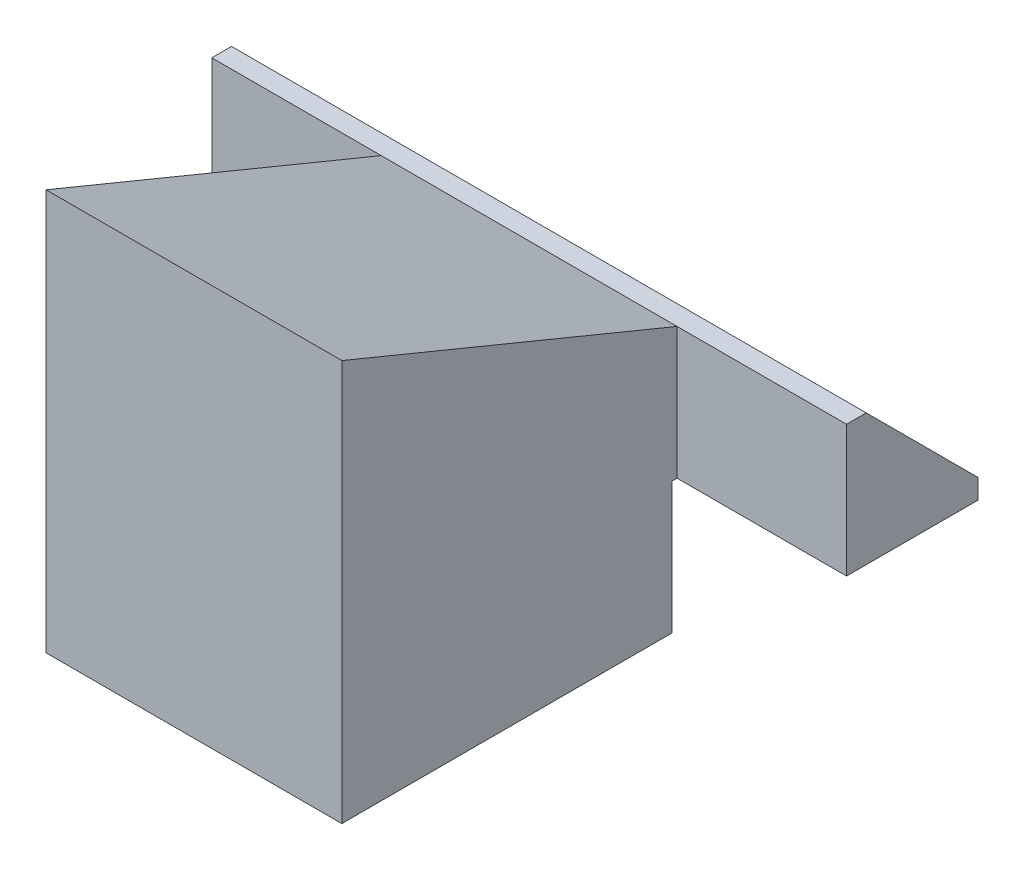
ISO-10303-21;
HEADER;
FILE_DESCRIPTION(('STEP AP214'),'2;1');
FILE_NAME('part.step','',(''),(''),'','','');
FILE_SCHEMA(('AUTOMOTIVE_DESIGN { 1 0 10303 214 1 1 1 1 }'));
ENDSEC;
DATA;
#1=APPLICATION_CONTEXT('core data for automotive mechanical design processes');
#2=APPLICATION_PROTOCOL_DEFINITION('international standard','automotive_design',2000,#1);
#3=PRODUCT_CONTEXT('',#1,'mechanical');
#4=PRODUCT('Part','Part','',(#3));
#5=PRODUCT_RELATED_PRODUCT_CATEGORY('part','',(#4));
#6=PRODUCT_DEFINITION_FORMATION('','',#4);
#7=PRODUCT_DEFINITION_CONTEXT('part definition',#1,'design');
#8=PRODUCT_DEFINITION('design','',#6,#7);
#9=PRODUCT_DEFINITION_SHAPE('','',#8);
#10=(LENGTH_UNIT() NAMED_UNIT(*) SI_UNIT(.MILLI.,.METRE.));
#11=(NAMED_UNIT(*) PLANE_ANGLE_UNIT() SI_UNIT($,.RADIAN.));
#12=(NAMED_UNIT(*) SI_UNIT($,.STERADIAN.) SOLID_ANGLE_UNIT());
#13=UNCERTAINTY_MEASURE_WITH_UNIT(LENGTH_MEASURE(1.E-05),#10,'distance_accuracy_value','');
#14=(GEOMETRIC_REPRESENTATION_CONTEXT(3) GLOBAL_UNCERTAINTY_ASSIGNED_CONTEXT((#13)) GLOBAL_UNIT_ASSIGNED_CONTEXT((#10,
#11,#12)) REPRESENTATION_CONTEXT('',''));
#15=CARTESIAN_POINT('',(0.,0.,0.));
#16=DIRECTION('',(0.,0.,1.));
#17=DIRECTION('',(1.,0.,0.));
#18=AXIS2_PLACEMENT_3D('',#15,#16,#17);
#19=CARTESIAN_POINT('',(-48.2790697674419,-20.,51.));
#20=DIRECTION('',(0.,1.,0.));
#21=DIRECTION('',(0.,0.,1.));
#22=AXIS2_PLACEMENT_3D('',#19,#20,#21);
#23=PLANE('',#22);
#24=DIRECTION('',(-1.,0.,0.));
#25=VECTOR('',#24,1.);
#26=CARTESIAN_POINT('',(-22.5,-20.,0.8));
#27=LINE('',#26,#25);
#28=CARTESIAN_POINT('',(22.5,-20.,0.8));
#29=VERTEX_POINT('',#28);
#30=CARTESIAN_POINT('',(-22.5,-20.,0.799999999999988));
#31=VERTEX_POINT('',#30);
#32=EDGE_CURVE('E65',#29,#31,#27,.T.);
#33=ORIENTED_EDGE('',*,*,#32,.F.);
#34=DIRECTION('',(0.,0.,1.));
#35=VECTOR('',#34,1.);
#36=CARTESIAN_POINT('',(22.5,-20.,-47.5873978914023));
#37=LINE('',#36,#35);
#38=CARTESIAN_POINT('',(22.5,-20.,51.));
#39=VERTEX_POINT('',#38);
#40=EDGE_CURVE('E231',#29,#39,#37,.T.);
#41=ORIENTED_EDGE('',*,*,#40,.T.);
#42=DIRECTION('',(1.,0.,0.));
#43=VECTOR('',#42,1.);
#44=CARTESIAN_POINT('',(-48.2790697674419,-20.,51.));
#45=LINE('',#44,#43);
#46=CARTESIAN_POINT('',(-22.5,-20.,51.));
#47=VERTEX_POINT('',#46);
#48=EDGE_CURVE('E379',#47,#39,#45,.T.);
#49=ORIENTED_EDGE('',*,*,#48,.F.);
#50=DIRECTION('',(0.,0.,1.));
#51=VECTOR('',#50,1.);
#52=CARTESIAN_POINT('',(-22.5,-20.,-47.5873978914023));
#53=LINE('',#52,#51);
#54=EDGE_CURVE('E217',#31,#47,#53,.T.);
#55=ORIENTED_EDGE('',*,*,#54,.F.);
#56=EDGE_LOOP('',(#33,#41,#49,#55));
#57=FACE_BOUND('',#56,.T.);
#58=ADVANCED_FACE('F47',(#57),#23,.F.);
#59=CARTESIAN_POINT('',(-48.2790697674419,20.,51.));
#60=DIRECTION('',(0.,-1.,0.));
#61=DIRECTION('',(0.,0.,-1.));
#62=AXIS2_PLACEMENT_3D('',#59,#60,#61);
#63=PLANE('',#62);
#64=DIRECTION('',(-1.,0.,0.));
#65=VECTOR('',#64,1.);
#66=CARTESIAN_POINT('',(22.5,20.,0.));
#67=LINE('',#66,#65);
#68=CARTESIAN_POINT('',(22.5,20.,0.));
#69=VERTEX_POINT('',#68);
#70=CARTESIAN_POINT('',(-22.5,20.,0.));
#71=VERTEX_POINT('',#70);
#72=EDGE_CURVE('E206',#69,#71,#67,.T.);
#73=ORIENTED_EDGE('',*,*,#72,.F.);
#74=DIRECTION('',(1.,0.,0.));
#75=VECTOR('',#74,1.);
#76=CARTESIAN_POINT('',(22.5,20.,0.));
#77=LINE('',#76,#75);
#78=CARTESIAN_POINT('',(48.2790697674419,20.,0.));
#79=VERTEX_POINT('',#78);
#80=EDGE_CURVE('E241',#69,#79,#77,.T.);
#81=ORIENTED_EDGE('',*,*,#80,.T.);
#82=DIRECTION('',(0.,0.,-1.));
#83=VECTOR('',#82,1.);
#84=CARTESIAN_POINT('',(48.2790697674419,20.,51.));
#85=LINE('',#84,#83);
#86=CARTESIAN_POINT('',(48.2790697674419,20.,-3.));
#87=VERTEX_POINT('',#86);
#88=EDGE_CURVE('E11',#79,#87,#85,.T.);
#89=ORIENTED_EDGE('',*,*,#88,.T.);
#90=DIRECTION('',(1.,0.,0.));
#91=VECTOR('',#90,1.);
#92=CARTESIAN_POINT('',(-48.2790697674419,20.,-3.));
#93=LINE('',#92,#91);
#94=CARTESIAN_POINT('',(43.2790697674419,20.,-3.));
#95=VERTEX_POINT('',#94);
#96=EDGE_CURVE('E282',#95,#87,#93,.T.);
#97=ORIENTED_EDGE('',*,*,#96,.F.);
#98=DIRECTION('',(1.,0.,0.));
#99=VECTOR('',#98,1.);
#100=CARTESIAN_POINT('',(5.,20.,-3.));
#101=LINE('',#100,#99);
#102=CARTESIAN_POINT('',(5.,20.,-3.));
#103=VERTEX_POINT('',#102);
#104=EDGE_CURVE('E323',#103,#95,#101,.T.);
#105=ORIENTED_EDGE('',*,*,#104,.F.);
#106=CARTESIAN_POINT('',(-5.,20.,-3.));
#107=VERTEX_POINT('',#106);
#108=EDGE_CURVE('E281',#107,#103,#93,.T.);
#109=ORIENTED_EDGE('',*,*,#108,.F.);
#110=DIRECTION('',(1.,0.,0.));
#111=VECTOR('',#110,1.);
#112=CARTESIAN_POINT('',(-43.2790697674419,20.,-3.));
#113=LINE('',#112,#111);
#114=CARTESIAN_POINT('',(-43.2790697674419,20.,-3.));
#115=VERTEX_POINT('',#114);
#116=EDGE_CURVE('E307',#115,#107,#113,.T.);
#117=ORIENTED_EDGE('',*,*,#116,.F.);
#118=CARTESIAN_POINT('',(-48.2790697674419,20.,-3.));
#119=VERTEX_POINT('',#118);
#120=EDGE_CURVE('E277',#119,#115,#93,.T.);
#121=ORIENTED_EDGE('',*,*,#120,.F.);
#122=DIRECTION('',(0.,0.,-1.));
#123=VECTOR('',#122,1.);
#124=CARTESIAN_POINT('',(-48.2790697674419,20.,51.));
#125=LINE('',#124,#123);
#126=CARTESIAN_POINT('',(-48.2790697674419,20.,0.));
#127=VERTEX_POINT('',#126);
#128=EDGE_CURVE('E57',#127,#119,#125,.T.);
#129=ORIENTED_EDGE('',*,*,#128,.F.);
#130=DIRECTION('',(1.,0.,0.));
#131=VECTOR('',#130,1.);
#132=CARTESIAN_POINT('',(-48.2790697674419,20.,0.));
#133=LINE('',#132,#131);
#134=EDGE_CURVE('E216',#127,#71,#133,.T.);
#135=ORIENTED_EDGE('',*,*,#134,.T.);
#136=EDGE_LOOP('',(#73,#81,#89,#97,#105,#109,#117,#121,#129,#135));
#137=FACE_BOUND('',#136,.T.);
#138=ADVANCED_FACE('F410',(#137),#63,.F.);
#139=CARTESIAN_POINT('',(48.2790697674419,20.,51.));
#140=DIRECTION('',(-1.,0.,0.));
#141=DIRECTION('',(0.,0.,1.));
#142=AXIS2_PLACEMENT_3D('',#139,#140,#141);
#143=PLANE('',#142);
#144=DIRECTION('',(0.,-1.,0.));
#145=VECTOR('',#144,1.);
#146=CARTESIAN_POINT('',(48.2790697674419,20.,0.));
#147=LINE('',#146,#145);
#148=CARTESIAN_POINT('',(48.2790697674419,0.,0.));
#149=VERTEX_POINT('',#148);
#150=EDGE_CURVE('E234',#79,#149,#147,.T.);
#151=ORIENTED_EDGE('',*,*,#150,.T.);
#152=DIRECTION('',(0.,0.,1.));
#153=VECTOR('',#152,1.);
#154=CARTESIAN_POINT('',(48.2790697674419,0.,-20.));
#155=LINE('',#154,#153);
#156=CARTESIAN_POINT('',(48.2790697674419,0.,-20.));
#157=VERTEX_POINT('',#156);
#158=EDGE_CURVE('E375',#157,#149,#155,.T.);
#159=ORIENTED_EDGE('',*,*,#158,.F.);
#160=DIRECTION('',(0.,-1.,0.));
#161=VECTOR('',#160,1.);
#162=CARTESIAN_POINT('',(48.2790697674419,20.,-20.));
#163=LINE('',#162,#161);
#164=CARTESIAN_POINT('',(48.2790697674419,3.,-20.));
#165=VERTEX_POINT('',#164);
#166=EDGE_CURVE('E358',#165,#157,#163,.T.);
#167=ORIENTED_EDGE('',*,*,#166,.F.);
#168=DIRECTION('',(0.,-0.707106781186547,-0.707106781186547));
#169=VECTOR('',#168,1.);
#170=CARTESIAN_POINT('',(48.2790697674419,3.,-20.));
#171=LINE('',#170,#169);
#172=EDGE_CURVE('E269',#87,#165,#171,.T.);
#173=ORIENTED_EDGE('',*,*,#172,.F.);
#174=ORIENTED_EDGE('',*,*,#88,.F.);
#175=EDGE_LOOP('',(#151,#159,#167,#173,#174));
#176=FACE_BOUND('',#175,.T.);
#177=ADVANCED_FACE('F49',(#176),#143,.F.);
#178=CARTESIAN_POINT('',(-48.2790697674419,20.,51.));
#179=DIRECTION('',(1.,0.,0.));
#180=DIRECTION('',(0.,0.,-1.));
#181=AXIS2_PLACEMENT_3D('',#178,#179,#180);
#182=PLANE('',#181);
#183=DIRECTION('',(0.,1.,0.));
#184=VECTOR('',#183,1.);
#185=CARTESIAN_POINT('',(-48.2790697674419,20.,0.));
#186=LINE('',#185,#184);
#187=CARTESIAN_POINT('',(-48.2790697674419,0.,0.));
#188=VERTEX_POINT('',#187);
#189=EDGE_CURVE('E220',#188,#127,#186,.T.);
#190=ORIENTED_EDGE('',*,*,#189,.T.);
#191=ORIENTED_EDGE('',*,*,#128,.T.);
#192=DIRECTION('',(0.,-0.707106781186547,-0.707106781186547));
#193=VECTOR('',#192,1.);
#194=CARTESIAN_POINT('',(-48.2790697674419,3.,-20.));
#195=LINE('',#194,#193);
#196=CARTESIAN_POINT('',(-48.2790697674419,3.,-20.));
#197=VERTEX_POINT('',#196);
#198=EDGE_CURVE('E270',#119,#197,#195,.T.);
#199=ORIENTED_EDGE('',*,*,#198,.T.);
#200=DIRECTION('',(0.,1.,0.));
#201=VECTOR('',#200,1.);
#202=CARTESIAN_POINT('',(-48.2790697674419,20.,-20.));
#203=LINE('',#202,#201);
#204=CARTESIAN_POINT('',(-48.2790697674419,0.,-20.));
#205=VERTEX_POINT('',#204);
#206=EDGE_CURVE('E365',#205,#197,#203,.T.);
#207=ORIENTED_EDGE('',*,*,#206,.F.);
#208=DIRECTION('',(0.,0.,1.));
#209=VECTOR('',#208,1.);
#210=CARTESIAN_POINT('',(-48.2790697674419,0.,-20.));
#211=LINE('',#210,#209);
#212=EDGE_CURVE('E369',#205,#188,#211,.T.);
#213=ORIENTED_EDGE('',*,*,#212,.T.);
#214=EDGE_LOOP('',(#190,#191,#199,#207,#213));
#215=FACE_BOUND('',#214,.T.);
#216=ADVANCED_FACE('F421',(#215),#182,.F.);
#217=CARTESIAN_POINT('',(0.,0.,51.));
#218=DIRECTION('',(0.,0.,1.));
#219=DIRECTION('',(1.,0.,0.));
#220=AXIS2_PLACEMENT_3D('',#217,#218,#219);
#221=PLANE('',#220);
#222=DIRECTION('',(0.,1.,0.));
#223=VECTOR('',#222,1.);
#224=CARTESIAN_POINT('',(-22.5,20.,51.));
#225=LINE('',#224,#223);
#226=CARTESIAN_POINT('',(-22.5,41.,51.));
#227=VERTEX_POINT('',#226);
#228=EDGE_CURVE('E225',#47,#227,#225,.T.);
#229=ORIENTED_EDGE('',*,*,#228,.F.);
#230=ORIENTED_EDGE('',*,*,#48,.T.);
#231=DIRECTION('',(0.,-1.,0.));
#232=VECTOR('',#231,1.);
#233=CARTESIAN_POINT('',(22.5,20.,51.));
#234=LINE('',#233,#232);
#235=CARTESIAN_POINT('',(22.5,41.,51.));
#236=VERTEX_POINT('',#235);
#237=EDGE_CURVE('E228',#236,#39,#234,.T.);
#238=ORIENTED_EDGE('',*,*,#237,.F.);
#239=DIRECTION('',(-1.,0.,0.));
#240=VECTOR('',#239,1.);
#241=CARTESIAN_POINT('',(22.5,41.,51.));
#242=LINE('',#241,#240);
#243=EDGE_CURVE('E203',#236,#227,#242,.T.);
#244=ORIENTED_EDGE('',*,*,#243,.T.);
#245=EDGE_LOOP('',(#229,#230,#238,#244));
#246=FACE_BOUND('',#245,.T.);
#247=ADVANCED_FACE('F419',(#246),#221,.T.);
#248=CARTESIAN_POINT('',(48.2790697674419,0.,-20.));
#249=DIRECTION('',(0.,1.,0.));
#250=DIRECTION('',(0.,0.,1.));
#251=AXIS2_PLACEMENT_3D('',#248,#249,#250);
#252=PLANE('',#251);
#253=CARTESIAN_POINT('',(-33.2790697674419,0.,-10.));
#254=DIRECTION('',(0.,1.,0.));
#255=DIRECTION('',(0.,0.,1.));
#256=AXIS2_PLACEMENT_3D('',#253,#254,#255);
#257=CIRCLE('',#256,1.9);
#258=CARTESIAN_POINT('',(-33.2790697674419,0.,-8.1));
#259=VERTEX_POINT('',#258);
#260=EDGE_CURVE('E51',#259,#259,#257,.T.);
#261=ORIENTED_EDGE('',*,*,#260,.T.);
#262=EDGE_LOOP('',(#261));
#263=FACE_BOUND('',#262,.T.);
#264=CARTESIAN_POINT('',(-15.,0.,-10.));
#265=DIRECTION('',(0.,1.,0.));
#266=DIRECTION('',(0.,0.,1.));
#267=AXIS2_PLACEMENT_3D('',#264,#265,#266);
#268=CIRCLE('',#267,1.9);
#269=CARTESIAN_POINT('',(-15.,0.,-8.1));
#270=VERTEX_POINT('',#269);
#271=EDGE_CURVE('E255',#270,#270,#268,.T.);
#272=ORIENTED_EDGE('',*,*,#271,.T.);
#273=EDGE_LOOP('',(#272));
#274=FACE_BOUND('',#273,.T.);
#275=CARTESIAN_POINT('',(15.,0.,-10.));
#276=DIRECTION('',(0.,1.,0.));
#277=DIRECTION('',(0.,0.,1.));
#278=AXIS2_PLACEMENT_3D('',#275,#276,#277);
#279=CIRCLE('',#278,1.9);
#280=CARTESIAN_POINT('',(15.,0.,-8.1));
#281=VERTEX_POINT('',#280);
#282=EDGE_CURVE('E260',#281,#281,#279,.T.);
#283=ORIENTED_EDGE('',*,*,#282,.T.);
#284=EDGE_LOOP('',(#283));
#285=FACE_BOUND('',#284,.T.);
#286=CARTESIAN_POINT('',(33.2790697674419,0.,-10.));
#287=DIRECTION('',(0.,1.,0.));
#288=DIRECTION('',(0.,0.,1.));
#289=AXIS2_PLACEMENT_3D('',#286,#287,#288);
#290=CIRCLE('',#289,1.9);
#291=CARTESIAN_POINT('',(33.2790697674419,0.,-8.1));
#292=VERTEX_POINT('',#291);
#293=EDGE_CURVE('E265',#292,#292,#290,.T.);
#294=ORIENTED_EDGE('',*,*,#293,.T.);
#295=EDGE_LOOP('',(#294));
#296=FACE_BOUND('',#295,.T.);
#297=DIRECTION('',(-1.,0.,0.));
#298=VECTOR('',#297,1.);
#299=CARTESIAN_POINT('',(48.2790697674419,0.,0.));
#300=LINE('',#299,#298);
#301=CARTESIAN_POINT('',(22.5,0.,0.));
#302=VERTEX_POINT('',#301);
#303=EDGE_CURVE('E362',#149,#302,#300,.T.);
#304=ORIENTED_EDGE('',*,*,#303,.T.);
#305=DIRECTION('',(0.,0.,-1.));
#306=VECTOR('',#305,1.);
#307=CARTESIAN_POINT('',(22.5,0.,0.8));
#308=LINE('',#307,#306);
#309=CARTESIAN_POINT('',(22.5,0.,0.8));
#310=VERTEX_POINT('',#309);
#311=EDGE_CURVE('E175',#310,#302,#308,.T.);
#312=ORIENTED_EDGE('',*,*,#311,.F.);
#313=DIRECTION('',(1.,0.,0.));
#314=VECTOR('',#313,1.);
#315=CARTESIAN_POINT('',(-22.5,0.,0.8));
#316=LINE('',#315,#314);
#317=CARTESIAN_POINT('',(-22.5,0.,0.8));
#318=VERTEX_POINT('',#317);
#319=EDGE_CURVE('E168',#318,#310,#316,.T.);
#320=ORIENTED_EDGE('',*,*,#319,.F.);
#321=DIRECTION('',(0.,0.,-1.));
#322=VECTOR('',#321,1.);
#323=CARTESIAN_POINT('',(-22.5,0.,0.8));
#324=LINE('',#323,#322);
#325=CARTESIAN_POINT('',(-22.5,0.,0.));
#326=VERTEX_POINT('',#325);
#327=EDGE_CURVE('E173',#318,#326,#324,.T.);
#328=ORIENTED_EDGE('',*,*,#327,.T.);
#329=EDGE_CURVE('E328',#326,#188,#300,.T.);
#330=ORIENTED_EDGE('',*,*,#329,.T.);
#331=ORIENTED_EDGE('',*,*,#212,.F.);
#332=DIRECTION('',(-1.,0.,0.));
#333=VECTOR('',#332,1.);
#334=CARTESIAN_POINT('',(48.2790697674419,0.,-20.));
#335=LINE('',#334,#333);
#336=EDGE_CURVE('E361',#157,#205,#335,.T.);
#337=ORIENTED_EDGE('',*,*,#336,.F.);
#338=ORIENTED_EDGE('',*,*,#158,.T.);
#339=EDGE_LOOP('',(#304,#312,#320,#328,#330,#331,#337,#338));
#340=FACE_BOUND('',#339,.T.);
#341=ADVANCED_FACE('F170',(#263,#274,#285,#296,#340),#252,.F.);
#342=CARTESIAN_POINT('',(0.,0.,-20.));
#343=DIRECTION('',(0.,0.,-1.));
#344=DIRECTION('',(-1.,0.,0.));
#345=AXIS2_PLACEMENT_3D('',#342,#343,#344);
#346=PLANE('',#345);
#347=DIRECTION('',(1.,0.,0.));
#348=VECTOR('',#347,1.);
#349=CARTESIAN_POINT('',(-48.2790697674419,3.,-20.));
#350=LINE('',#349,#348);
#351=CARTESIAN_POINT('',(43.2790697674419,3.,-20.));
#352=VERTEX_POINT('',#351);
#353=EDGE_CURVE('E274',#352,#165,#350,.T.);
#354=ORIENTED_EDGE('',*,*,#353,.T.);
#355=ORIENTED_EDGE('',*,*,#166,.T.);
#356=ORIENTED_EDGE('',*,*,#336,.T.);
#357=ORIENTED_EDGE('',*,*,#206,.T.);
#358=CARTESIAN_POINT('',(-43.2790697674419,3.,-20.));
#359=VERTEX_POINT('',#358);
#360=EDGE_CURVE('E283',#197,#359,#350,.T.);
#361=ORIENTED_EDGE('',*,*,#360,.T.);
#362=DIRECTION('',(-1.,0.,0.));
#363=VECTOR('',#362,1.);
#364=CARTESIAN_POINT('',(-43.2790697674419,3.,-20.));
#365=LINE('',#364,#363);
#366=CARTESIAN_POINT('',(-5.,3.,-20.));
#367=VERTEX_POINT('',#366);
#368=EDGE_CURVE('E315',#367,#359,#365,.T.);
#369=ORIENTED_EDGE('',*,*,#368,.F.);
#370=CARTESIAN_POINT('',(5.,3.,-20.));
#371=VERTEX_POINT('',#370);
#372=EDGE_CURVE('E73',#367,#371,#350,.T.);
#373=ORIENTED_EDGE('',*,*,#372,.T.);
#374=DIRECTION('',(-1.,0.,0.));
#375=VECTOR('',#374,1.);
#376=CARTESIAN_POINT('',(5.,3.,-20.));
#377=LINE('',#376,#375);
#378=EDGE_CURVE('E336',#352,#371,#377,.T.);
#379=ORIENTED_EDGE('',*,*,#378,.F.);
#380=EDGE_LOOP('',(#354,#355,#356,#357,#361,#369,#373,#379));
#381=FACE_BOUND('',#380,.T.);
#382=ADVANCED_FACE('F452',(#381),#346,.T.);
#383=CARTESIAN_POINT('',(5.,3.,-20.));
#384=DIRECTION('',(-1.,0.,0.));
#385=DIRECTION('',(0.,0.,1.));
#386=AXIS2_PLACEMENT_3D('',#383,#384,#385);
#387=PLANE('',#386);
#388=DIRECTION('',(0.,0.,1.));
#389=VECTOR('',#388,1.);
#390=CARTESIAN_POINT('',(5.,3.,-20.));
#391=LINE('',#390,#389);
#392=CARTESIAN_POINT('',(5.,3.,-3.));
#393=VERTEX_POINT('',#392);
#394=EDGE_CURVE('E343',#371,#393,#391,.T.);
#395=ORIENTED_EDGE('',*,*,#394,.F.);
#396=DIRECTION('',(0.,0.707106781186548,0.707106781186548));
#397=VECTOR('',#396,1.);
#398=CARTESIAN_POINT('',(5.,3.,-20.));
#399=LINE('',#398,#397);
#400=EDGE_CURVE('E297',#371,#103,#399,.T.);
#401=ORIENTED_EDGE('',*,*,#400,.T.);
#402=DIRECTION('',(0.,1.,0.));
#403=VECTOR('',#402,1.);
#404=CARTESIAN_POINT('',(5.,3.,-3.));
#405=LINE('',#404,#403);
#406=EDGE_CURVE('E332',#393,#103,#405,.T.);
#407=ORIENTED_EDGE('',*,*,#406,.F.);
#408=EDGE_LOOP('',(#395,#401,#407));
#409=FACE_BOUND('',#408,.T.);
#410=ADVANCED_FACE('F521',(#409),#387,.F.);
#411=CARTESIAN_POINT('',(43.2790697674419,3.,-20.));
#412=DIRECTION('',(1.,0.,0.));
#413=DIRECTION('',(0.,0.,-1.));
#414=AXIS2_PLACEMENT_3D('',#411,#412,#413);
#415=PLANE('',#414);
#416=DIRECTION('',(0.,1.,0.));
#417=VECTOR('',#416,1.);
#418=CARTESIAN_POINT('',(43.2790697674419,3.,-3.));
#419=LINE('',#418,#417);
#420=CARTESIAN_POINT('',(43.2790697674419,3.,-3.));
#421=VERTEX_POINT('',#420);
#422=EDGE_CURVE('E301',#421,#95,#419,.T.);
#423=ORIENTED_EDGE('',*,*,#422,.T.);
#424=DIRECTION('',(0.,-0.707106781186548,-0.707106781186548));
#425=VECTOR('',#424,1.);
#426=CARTESIAN_POINT('',(43.2790697674419,3.,-20.));
#427=LINE('',#426,#425);
#428=EDGE_CURVE('E293',#95,#352,#427,.T.);
#429=ORIENTED_EDGE('',*,*,#428,.T.);
#430=DIRECTION('',(0.,0.,-1.));
#431=VECTOR('',#430,1.);
#432=CARTESIAN_POINT('',(43.2790697674419,3.,-20.));
#433=LINE('',#432,#431);
#434=EDGE_CURVE('E347',#421,#352,#433,.T.);
#435=ORIENTED_EDGE('',*,*,#434,.F.);
#436=EDGE_LOOP('',(#423,#429,#435));
#437=FACE_BOUND('',#436,.T.);
#438=ADVANCED_FACE('F487',(#437),#415,.F.);
#439=CARTESIAN_POINT('',(5.,3.,-3.));
#440=DIRECTION('',(0.,0.,1.));
#441=DIRECTION('',(1.,0.,0.));
#442=AXIS2_PLACEMENT_3D('',#439,#440,#441);
#443=PLANE('',#442);
#444=ORIENTED_EDGE('',*,*,#104,.T.);
#445=ORIENTED_EDGE('',*,*,#422,.F.);
#446=DIRECTION('',(1.,0.,0.));
#447=VECTOR('',#446,1.);
#448=CARTESIAN_POINT('',(5.,3.,-3.));
#449=LINE('',#448,#447);
#450=EDGE_CURVE('E351',#393,#421,#449,.T.);
#451=ORIENTED_EDGE('',*,*,#450,.F.);
#452=ORIENTED_EDGE('',*,*,#406,.T.);
#453=EDGE_LOOP('',(#444,#445,#451,#452));
#454=FACE_BOUND('',#453,.T.);
#455=ADVANCED_FACE('F492',(#454),#443,.F.);
#456=CARTESIAN_POINT('',(0.,3.,0.));
#457=DIRECTION('',(0.,1.,0.));
#458=DIRECTION('',(0.,0.,1.));
#459=AXIS2_PLACEMENT_3D('',#456,#457,#458);
#460=PLANE('',#459);
#461=CARTESIAN_POINT('',(15.,3.,-10.));
#462=DIRECTION('',(0.,1.,0.));
#463=DIRECTION('',(0.,0.,1.));
#464=AXIS2_PLACEMENT_3D('',#461,#462,#463);
#465=CIRCLE('',#464,1.9);
#466=CARTESIAN_POINT('',(15.,3.,-8.1));
#467=VERTEX_POINT('',#466);
#468=EDGE_CURVE('E256',#467,#467,#465,.T.);
#469=ORIENTED_EDGE('',*,*,#468,.F.);
#470=EDGE_LOOP('',(#469));
#471=FACE_BOUND('',#470,.T.);
#472=CARTESIAN_POINT('',(33.2790697674419,3.,-10.));
#473=DIRECTION('',(0.,1.,0.));
#474=DIRECTION('',(0.,0.,1.));
#475=AXIS2_PLACEMENT_3D('',#472,#473,#474);
#476=CIRCLE('',#475,1.9);
#477=CARTESIAN_POINT('',(33.2790697674419,3.,-8.1));
#478=VERTEX_POINT('',#477);
#479=EDGE_CURVE('E261',#478,#478,#476,.T.);
#480=ORIENTED_EDGE('',*,*,#479,.F.);
#481=EDGE_LOOP('',(#480));
#482=FACE_BOUND('',#481,.T.);
#483=ORIENTED_EDGE('',*,*,#394,.T.);
#484=ORIENTED_EDGE('',*,*,#450,.T.);
#485=ORIENTED_EDGE('',*,*,#434,.T.);
#486=ORIENTED_EDGE('',*,*,#378,.T.);
#487=EDGE_LOOP('',(#483,#484,#485,#486));
#488=FACE_BOUND('',#487,.T.);
#489=ADVANCED_FACE('F489',(#471,#482,#488),#460,.T.);
#490=CARTESIAN_POINT('',(-43.2790697674419,3.,-20.));
#491=DIRECTION('',(-1.,0.,0.));
#492=DIRECTION('',(0.,0.,1.));
#493=AXIS2_PLACEMENT_3D('',#490,#491,#492);
#494=PLANE('',#493);
#495=DIRECTION('',(0.,0.,1.));
#496=VECTOR('',#495,1.);
#497=CARTESIAN_POINT('',(-43.2790697674419,3.,-20.));
#498=LINE('',#497,#496);
#499=CARTESIAN_POINT('',(-43.2790697674419,3.,-3.));
#500=VERTEX_POINT('',#499);
#501=EDGE_CURVE('E302',#359,#500,#498,.T.);
#502=ORIENTED_EDGE('',*,*,#501,.F.);
#503=DIRECTION('',(0.,0.707106781186548,0.707106781186548));
#504=VECTOR('',#503,1.);
#505=CARTESIAN_POINT('',(-43.2790697674419,3.,-20.));
#506=LINE('',#505,#504);
#507=EDGE_CURVE('E289',#359,#115,#506,.T.);
#508=ORIENTED_EDGE('',*,*,#507,.T.);
#509=DIRECTION('',(0.,1.,0.));
#510=VECTOR('',#509,1.);
#511=CARTESIAN_POINT('',(-43.2790697674419,3.,-3.));
#512=LINE('',#511,#510);
#513=EDGE_CURVE('E319',#500,#115,#512,.T.);
#514=ORIENTED_EDGE('',*,*,#513,.F.);
#515=EDGE_LOOP('',(#502,#508,#514));
#516=FACE_BOUND('',#515,.T.);
#517=ADVANCED_FACE('F442',(#516),#494,.F.);
#518=CARTESIAN_POINT('',(-5.,3.,-20.));
#519=DIRECTION('',(1.,0.,0.));
#520=DIRECTION('',(0.,0.,-1.));
#521=AXIS2_PLACEMENT_3D('',#518,#519,#520);
#522=PLANE('',#521);
#523=DIRECTION('',(0.,1.,0.));
#524=VECTOR('',#523,1.);
#525=CARTESIAN_POINT('',(-5.,3.,-3.));
#526=LINE('',#525,#524);
#527=CARTESIAN_POINT('',(-5.,3.,-3.));
#528=VERTEX_POINT('',#527);
#529=EDGE_CURVE('E324',#528,#107,#526,.T.);
#530=ORIENTED_EDGE('',*,*,#529,.T.);
#531=DIRECTION('',(0.,-0.707106781186548,-0.707106781186548));
#532=VECTOR('',#531,1.);
#533=CARTESIAN_POINT('',(-5.,3.,-20.));
#534=LINE('',#533,#532);
#535=EDGE_CURVE('E280',#107,#367,#534,.T.);
#536=ORIENTED_EDGE('',*,*,#535,.T.);
#537=DIRECTION('',(0.,0.,-1.));
#538=VECTOR('',#537,1.);
#539=CARTESIAN_POINT('',(-5.,3.,-20.));
#540=LINE('',#539,#538);
#541=EDGE_CURVE('E311',#528,#367,#540,.T.);
#542=ORIENTED_EDGE('',*,*,#541,.F.);
#543=EDGE_LOOP('',(#530,#536,#542));
#544=FACE_BOUND('',#543,.T.);
#545=ADVANCED_FACE('F494',(#544),#522,.F.);
#546=CARTESIAN_POINT('',(-43.2790697674419,3.,-3.));
#547=DIRECTION('',(0.,0.,1.));
#548=DIRECTION('',(1.,0.,0.));
#549=AXIS2_PLACEMENT_3D('',#546,#547,#548);
#550=PLANE('',#549);
#551=ORIENTED_EDGE('',*,*,#116,.T.);
#552=ORIENTED_EDGE('',*,*,#529,.F.);
#553=DIRECTION('',(1.,0.,0.));
#554=VECTOR('',#553,1.);
#555=CARTESIAN_POINT('',(-43.2790697674419,3.,-3.));
#556=LINE('',#555,#554);
#557=EDGE_CURVE('E306',#500,#528,#556,.T.);
#558=ORIENTED_EDGE('',*,*,#557,.F.);
#559=ORIENTED_EDGE('',*,*,#513,.T.);
#560=EDGE_LOOP('',(#551,#552,#558,#559));
#561=FACE_BOUND('',#560,.T.);
#562=ADVANCED_FACE('F445',(#561),#550,.F.);
#563=CARTESIAN_POINT('',(0.,3.,0.));
#564=DIRECTION('',(0.,1.,0.));
#565=DIRECTION('',(0.,0.,1.));
#566=AXIS2_PLACEMENT_3D('',#563,#564,#565);
#567=PLANE('',#566);
#568=CARTESIAN_POINT('',(-33.2790697674419,3.,-10.));
#569=DIRECTION('',(0.,1.,0.));
#570=DIRECTION('',(0.,0.,1.));
#571=AXIS2_PLACEMENT_3D('',#568,#569,#570);
#572=CIRCLE('',#571,1.9);
#573=CARTESIAN_POINT('',(-33.2790697674419,3.,-8.1));
#574=VERTEX_POINT('',#573);
#575=EDGE_CURVE('E224',#574,#574,#572,.T.);
#576=ORIENTED_EDGE('',*,*,#575,.F.);
#577=EDGE_LOOP('',(#576));
#578=FACE_BOUND('',#577,.T.);
#579=CARTESIAN_POINT('',(-15.,3.,-10.));
#580=DIRECTION('',(0.,1.,0.));
#581=DIRECTION('',(0.,0.,1.));
#582=AXIS2_PLACEMENT_3D('',#579,#580,#581);
#583=CIRCLE('',#582,1.9);
#584=CARTESIAN_POINT('',(-15.,3.,-8.1));
#585=VERTEX_POINT('',#584);
#586=EDGE_CURVE('E251',#585,#585,#583,.T.);
#587=ORIENTED_EDGE('',*,*,#586,.F.);
#588=EDGE_LOOP('',(#587));
#589=FACE_BOUND('',#588,.T.);
#590=ORIENTED_EDGE('',*,*,#501,.T.);
#591=ORIENTED_EDGE('',*,*,#557,.T.);
#592=ORIENTED_EDGE('',*,*,#541,.T.);
#593=ORIENTED_EDGE('',*,*,#368,.T.);
#594=EDGE_LOOP('',(#590,#591,#592,#593));
#595=FACE_BOUND('',#594,.T.);
#596=ADVANCED_FACE('F448',(#578,#589,#595),#567,.T.);
#597=CARTESIAN_POINT('',(-48.2790697674419,3.,-20.));
#598=DIRECTION('',(0.,-0.707106781186547,0.707106781186547));
#599=DIRECTION('',(0.,-0.707106781186548,-0.707106781186548));
#600=AXIS2_PLACEMENT_3D('',#597,#598,#599);
#601=PLANE('',#600);
#602=ORIENTED_EDGE('',*,*,#372,.F.);
#603=ORIENTED_EDGE('',*,*,#535,.F.);
#604=ORIENTED_EDGE('',*,*,#108,.T.);
#605=ORIENTED_EDGE('',*,*,#400,.F.);
#606=EDGE_LOOP('',(#602,#603,#604,#605));
#607=FACE_BOUND('',#606,.T.);
#608=ADVANCED_FACE('F495',(#607),#601,.F.);
#609=ORIENTED_EDGE('',*,*,#360,.F.);
#610=ORIENTED_EDGE('',*,*,#198,.F.);
#611=ORIENTED_EDGE('',*,*,#120,.T.);
#612=ORIENTED_EDGE('',*,*,#507,.F.);
#613=EDGE_LOOP('',(#609,#610,#611,#612));
#614=FACE_BOUND('',#613,.T.);
#615=ADVANCED_FACE('F439',(#614),#601,.F.);
#616=ORIENTED_EDGE('',*,*,#96,.T.);
#617=ORIENTED_EDGE('',*,*,#172,.T.);
#618=ORIENTED_EDGE('',*,*,#353,.F.);
#619=ORIENTED_EDGE('',*,*,#428,.F.);
#620=EDGE_LOOP('',(#616,#617,#618,#619));
#621=FACE_BOUND('',#620,.T.);
#622=ADVANCED_FACE('F484',(#621),#601,.F.);
#623=CARTESIAN_POINT('',(33.2790697674419,3.,-10.));
#624=DIRECTION('',(0.,1.,0.));
#625=DIRECTION('',(0.,0.,1.));
#626=AXIS2_PLACEMENT_3D('',#623,#624,#625);
#627=CYLINDRICAL_SURFACE('',#626,1.9);
#628=ORIENTED_EDGE('',*,*,#479,.T.);
#629=EDGE_LOOP('',(#628));
#630=FACE_BOUND('',#629,.T.);
#631=ORIENTED_EDGE('',*,*,#293,.F.);
#632=EDGE_LOOP('',(#631));
#633=FACE_BOUND('',#632,.T.);
#634=ADVANCED_FACE('F406',(#630,#633),#627,.F.);
#635=CARTESIAN_POINT('',(15.,3.,-10.));
#636=DIRECTION('',(0.,1.,0.));
#637=DIRECTION('',(0.,0.,1.));
#638=AXIS2_PLACEMENT_3D('',#635,#636,#637);
#639=CYLINDRICAL_SURFACE('',#638,1.9);
#640=ORIENTED_EDGE('',*,*,#468,.T.);
#641=EDGE_LOOP('',(#640));
#642=FACE_BOUND('',#641,.T.);
#643=ORIENTED_EDGE('',*,*,#282,.F.);
#644=EDGE_LOOP('',(#643));
#645=FACE_BOUND('',#644,.T.);
#646=ADVANCED_FACE('F396',(#642,#645),#639,.F.);
#647=CARTESIAN_POINT('',(-15.,3.,-10.));
#648=DIRECTION('',(0.,1.,0.));
#649=DIRECTION('',(0.,0.,1.));
#650=AXIS2_PLACEMENT_3D('',#647,#648,#649);
#651=CYLINDRICAL_SURFACE('',#650,1.9);
#652=ORIENTED_EDGE('',*,*,#586,.T.);
#653=EDGE_LOOP('',(#652));
#654=FACE_BOUND('',#653,.T.);
#655=ORIENTED_EDGE('',*,*,#271,.F.);
#656=EDGE_LOOP('',(#655));
#657=FACE_BOUND('',#656,.T.);
#658=ADVANCED_FACE('F393',(#654,#657),#651,.F.);
#659=CARTESIAN_POINT('',(-33.2790697674419,3.,-10.));
#660=DIRECTION('',(0.,1.,0.));
#661=DIRECTION('',(0.,0.,1.));
#662=AXIS2_PLACEMENT_3D('',#659,#660,#661);
#663=CYLINDRICAL_SURFACE('',#662,1.9);
#664=ORIENTED_EDGE('',*,*,#575,.T.);
#665=EDGE_LOOP('',(#664));
#666=FACE_BOUND('',#665,.T.);
#667=ORIENTED_EDGE('',*,*,#260,.F.);
#668=EDGE_LOOP('',(#667));
#669=FACE_BOUND('',#668,.T.);
#670=ADVANCED_FACE('F395',(#666,#669),#663,.F.);
#671=CARTESIAN_POINT('',(0.,0.,0.));
#672=DIRECTION('',(0.,0.,1.));
#673=DIRECTION('',(1.,0.,0.));
#674=AXIS2_PLACEMENT_3D('',#671,#672,#673);
#675=PLANE('',#674);
#676=ORIENTED_EDGE('',*,*,#303,.F.);
#677=ORIENTED_EDGE('',*,*,#150,.F.);
#678=ORIENTED_EDGE('',*,*,#80,.F.);
#679=DIRECTION('',(0.,1.,0.));
#680=VECTOR('',#679,1.);
#681=CARTESIAN_POINT('',(22.5,20.,0.));
#682=LINE('',#681,#680);
#683=EDGE_CURVE('E210',#302,#69,#682,.T.);
#684=ORIENTED_EDGE('',*,*,#683,.F.);
#685=EDGE_LOOP('',(#676,#677,#678,#684));
#686=FACE_BOUND('',#685,.T.);
#687=ADVANCED_FACE('F403',(#686),#675,.T.);
#688=CARTESIAN_POINT('',(22.5,20.,-47.5873978914023));
#689=DIRECTION('',(-1.,0.,0.));
#690=DIRECTION('',(0.,-1.,0.));
#691=AXIS2_PLACEMENT_3D('',#688,#689,#690);
#692=PLANE('',#691);
#693=DIRECTION('',(0.,-1.,0.));
#694=VECTOR('',#693,1.);
#695=CARTESIAN_POINT('',(22.5,-20.,0.8));
#696=LINE('',#695,#694);
#697=EDGE_CURVE('E178',#310,#29,#696,.T.);
#698=ORIENTED_EDGE('',*,*,#697,.F.);
#699=ORIENTED_EDGE('',*,*,#311,.T.);
#700=ORIENTED_EDGE('',*,*,#683,.T.);
#701=DIRECTION('',(0.,-0.380749805254295,-0.924678098474716));
#702=VECTOR('',#701,1.);
#703=CARTESIAN_POINT('',(22.5,41.,51.));
#704=LINE('',#703,#702);
#705=EDGE_CURVE('E199',#236,#69,#704,.T.);
#706=ORIENTED_EDGE('',*,*,#705,.F.);
#707=ORIENTED_EDGE('',*,*,#237,.T.);
#708=ORIENTED_EDGE('',*,*,#40,.F.);
#709=EDGE_LOOP('',(#698,#699,#700,#706,#707,#708));
#710=FACE_BOUND('',#709,.T.);
#711=ADVANCED_FACE('F472',(#710),#692,.F.);
#712=CARTESIAN_POINT('',(0.,0.,0.));
#713=DIRECTION('',(0.,0.,1.));
#714=DIRECTION('',(1.,0.,0.));
#715=AXIS2_PLACEMENT_3D('',#712,#713,#714);
#716=PLANE('',#715);
#717=ORIENTED_EDGE('',*,*,#329,.F.);
#718=DIRECTION('',(0.,-1.,0.));
#719=VECTOR('',#718,1.);
#720=CARTESIAN_POINT('',(-22.5,20.,0.));
#721=LINE('',#720,#719);
#722=EDGE_CURVE('E190',#71,#326,#721,.T.);
#723=ORIENTED_EDGE('',*,*,#722,.F.);
#724=ORIENTED_EDGE('',*,*,#134,.F.);
#725=ORIENTED_EDGE('',*,*,#189,.F.);
#726=EDGE_LOOP('',(#717,#723,#724,#725));
#727=FACE_BOUND('',#726,.T.);
#728=ADVANCED_FACE('F594',(#727),#716,.T.);
#729=CARTESIAN_POINT('',(-22.5,20.,-47.5873978914023));
#730=DIRECTION('',(1.,0.,0.));
#731=DIRECTION('',(0.,1.,0.));
#732=AXIS2_PLACEMENT_3D('',#729,#730,#731);
#733=PLANE('',#732);
#734=ORIENTED_EDGE('',*,*,#722,.T.);
#735=ORIENTED_EDGE('',*,*,#327,.F.);
#736=DIRECTION('',(0.,1.,0.));
#737=VECTOR('',#736,1.);
#738=CARTESIAN_POINT('',(-22.5,-20.,0.8));
#739=LINE('',#738,#737);
#740=EDGE_CURVE('E179',#31,#318,#739,.T.);
#741=ORIENTED_EDGE('',*,*,#740,.F.);
#742=ORIENTED_EDGE('',*,*,#54,.T.);
#743=ORIENTED_EDGE('',*,*,#228,.T.);
#744=DIRECTION('',(0.,-0.380749805254295,-0.924678098474716));
#745=VECTOR('',#744,1.);
#746=CARTESIAN_POINT('',(-22.5,41.,51.));
#747=LINE('',#746,#745);
#748=EDGE_CURVE('E195',#227,#71,#747,.T.);
#749=ORIENTED_EDGE('',*,*,#748,.T.);
#750=EDGE_LOOP('',(#734,#735,#741,#742,#743,#749));
#751=FACE_BOUND('',#750,.T.);
#752=ADVANCED_FACE('F187',(#751),#733,.F.);
#753=CARTESIAN_POINT('',(22.5,41.,51.));
#754=DIRECTION('',(0.,0.924678098474716,-0.380749805254295));
#755=DIRECTION('',(0.,0.380749805254295,0.924678098474716));
#756=AXIS2_PLACEMENT_3D('',#753,#754,#755);
#757=PLANE('',#756);
#758=ORIENTED_EDGE('',*,*,#748,.F.);
#759=ORIENTED_EDGE('',*,*,#243,.F.);
#760=ORIENTED_EDGE('',*,*,#705,.T.);
#761=ORIENTED_EDGE('',*,*,#72,.T.);
#762=EDGE_LOOP('',(#758,#759,#760,#761));
#763=FACE_BOUND('',#762,.T.);
#764=ADVANCED_FACE('F481',(#763),#757,.T.);
#765=CARTESIAN_POINT('',(0.,0.,0.8));
#766=DIRECTION('',(0.,0.,-1.));
#767=DIRECTION('',(-1.,0.,0.));
#768=AXIS2_PLACEMENT_3D('',#765,#766,#767);
#769=PLANE('',#768);
#770=ORIENTED_EDGE('',*,*,#740,.T.);
#771=ORIENTED_EDGE('',*,*,#319,.T.);
#772=ORIENTED_EDGE('',*,*,#697,.T.);
#773=ORIENTED_EDGE('',*,*,#32,.T.);
#774=EDGE_LOOP('',(#770,#771,#772,#773));
#775=FACE_BOUND('',#774,.T.);
#776=ADVANCED_FACE('F181',(#775),#769,.T.);
#777=CLOSED_SHELL('',(#58,#138,#177,#216,#247,#341,#382,#410,#438,#455,#489,#517,#545,#562,#596,
#608,#615,#622,#634,#646,#658,#670,#687,#711,#728,#752,#764,#776));
#778=MANIFOLD_SOLID_BREP('B2',#777);
#779=ADVANCED_BREP_SHAPE_REPRESENTATION('',(#18,#778),#14);
#780=SHAPE_DEFINITION_REPRESENTATION(#9,#779);
ENDSEC;
END-ISO-10303-21;
